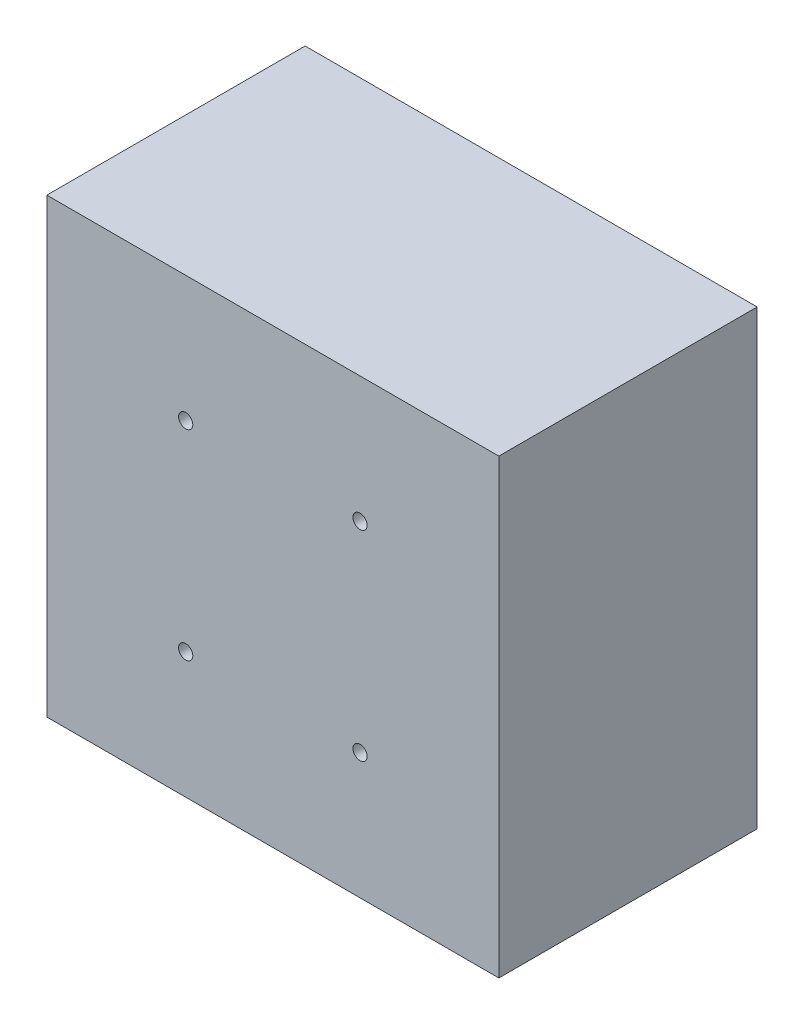
ISO-10303-21;
HEADER;
FILE_DESCRIPTION(('STEP AP214'),'2;1');
FILE_NAME('part.step','',(''),(''),'','','');
FILE_SCHEMA(('AUTOMOTIVE_DESIGN { 1 0 10303 214 1 1 1 1 }'));
ENDSEC;
DATA;
#1=APPLICATION_CONTEXT('core data for automotive mechanical design processes');
#2=APPLICATION_PROTOCOL_DEFINITION('international standard','automotive_design',2000,#1);
#3=PRODUCT_CONTEXT('',#1,'mechanical');
#4=PRODUCT('Part','Part','',(#3));
#5=PRODUCT_RELATED_PRODUCT_CATEGORY('part','',(#4));
#6=PRODUCT_DEFINITION_FORMATION('','',#4);
#7=PRODUCT_DEFINITION_CONTEXT('part definition',#1,'design');
#8=PRODUCT_DEFINITION('design','',#6,#7);
#9=PRODUCT_DEFINITION_SHAPE('','',#8);
#10=(LENGTH_UNIT() NAMED_UNIT(*) SI_UNIT(.MILLI.,.METRE.));
#11=(NAMED_UNIT(*) PLANE_ANGLE_UNIT() SI_UNIT($,.RADIAN.));
#12=(NAMED_UNIT(*) SI_UNIT($,.STERADIAN.) SOLID_ANGLE_UNIT());
#13=UNCERTAINTY_MEASURE_WITH_UNIT(LENGTH_MEASURE(1.E-05),#10,'distance_accuracy_value','');
#14=(GEOMETRIC_REPRESENTATION_CONTEXT(3) GLOBAL_UNCERTAINTY_ASSIGNED_CONTEXT((#13)) GLOBAL_UNIT_ASSIGNED_CONTEXT((#10,
#11,#12)) REPRESENTATION_CONTEXT('',''));
#15=CARTESIAN_POINT('',(0.,0.,0.));
#16=DIRECTION('',(0.,0.,1.));
#17=DIRECTION('',(1.,0.,0.));
#18=AXIS2_PLACEMENT_3D('',#15,#16,#17);
#19=CARTESIAN_POINT('',(0.,0.,40.));
#20=DIRECTION('',(1.,0.,0.));
#21=DIRECTION('',(0.,0.,-1.));
#22=AXIS2_PLACEMENT_3D('',#19,#20,#21);
#23=PLANE('',#22);
#24=DIRECTION('',(0.,-1.,0.));
#25=VECTOR('',#24,1.);
#26=CARTESIAN_POINT('',(0.,0.,0.));
#27=LINE('',#26,#25);
#28=CARTESIAN_POINT('',(0.,70.,0.));
#29=VERTEX_POINT('',#28);
#30=CARTESIAN_POINT('',(0.,0.,0.));
#31=VERTEX_POINT('',#30);
#32=EDGE_CURVE('E111',#29,#31,#27,.T.);
#33=ORIENTED_EDGE('',*,*,#32,.T.);
#34=DIRECTION('',(0.,0.,-1.));
#35=VECTOR('',#34,1.);
#36=CARTESIAN_POINT('',(0.,0.,40.));
#37=LINE('',#36,#35);
#38=CARTESIAN_POINT('',(0.,0.,40.));
#39=VERTEX_POINT('',#38);
#40=EDGE_CURVE('E11',#39,#31,#37,.T.);
#41=ORIENTED_EDGE('',*,*,#40,.F.);
#42=DIRECTION('',(0.,-1.,0.));
#43=VECTOR('',#42,1.);
#44=CARTESIAN_POINT('',(0.,0.,40.));
#45=LINE('',#44,#43);
#46=CARTESIAN_POINT('',(0.,70.,40.));
#47=VERTEX_POINT('',#46);
#48=EDGE_CURVE('E95',#47,#39,#45,.T.);
#49=ORIENTED_EDGE('',*,*,#48,.F.);
#50=DIRECTION('',(0.,0.,-1.));
#51=VECTOR('',#50,1.);
#52=CARTESIAN_POINT('',(0.,70.,40.));
#53=LINE('',#52,#51);
#54=EDGE_CURVE('E107',#47,#29,#53,.T.);
#55=ORIENTED_EDGE('',*,*,#54,.T.);
#56=EDGE_LOOP('',(#33,#41,#49,#55));
#57=FACE_BOUND('',#56,.T.);
#58=ADVANCED_FACE('F43',(#57),#23,.F.);
#59=CARTESIAN_POINT('',(0.,0.,40.));
#60=DIRECTION('',(0.,1.,0.));
#61=DIRECTION('',(0.,0.,1.));
#62=AXIS2_PLACEMENT_3D('',#59,#60,#61);
#63=PLANE('',#62);
#64=DIRECTION('',(1.,0.,0.));
#65=VECTOR('',#64,1.);
#66=CARTESIAN_POINT('',(0.,0.,0.));
#67=LINE('',#66,#65);
#68=CARTESIAN_POINT('',(70.,0.,0.));
#69=VERTEX_POINT('',#68);
#70=EDGE_CURVE('E100',#31,#69,#67,.T.);
#71=ORIENTED_EDGE('',*,*,#70,.T.);
#72=DIRECTION('',(0.,0.,-1.));
#73=VECTOR('',#72,1.);
#74=CARTESIAN_POINT('',(70.,0.,40.));
#75=LINE('',#74,#73);
#76=CARTESIAN_POINT('',(70.,0.,40.));
#77=VERTEX_POINT('',#76);
#78=EDGE_CURVE('E52',#77,#69,#75,.T.);
#79=ORIENTED_EDGE('',*,*,#78,.F.);
#80=DIRECTION('',(1.,0.,0.));
#81=VECTOR('',#80,1.);
#82=CARTESIAN_POINT('',(0.,0.,40.));
#83=LINE('',#82,#81);
#84=EDGE_CURVE('E90',#39,#77,#83,.T.);
#85=ORIENTED_EDGE('',*,*,#84,.F.);
#86=ORIENTED_EDGE('',*,*,#40,.T.);
#87=EDGE_LOOP('',(#71,#79,#85,#86));
#88=FACE_BOUND('',#87,.T.);
#89=ADVANCED_FACE('F99',(#88),#63,.F.);
#90=CARTESIAN_POINT('',(70.,0.,40.));
#91=DIRECTION('',(-1.,0.,0.));
#92=DIRECTION('',(0.,0.,1.));
#93=AXIS2_PLACEMENT_3D('',#90,#91,#92);
#94=PLANE('',#93);
#95=DIRECTION('',(0.,1.,0.));
#96=VECTOR('',#95,1.);
#97=CARTESIAN_POINT('',(70.,0.,0.));
#98=LINE('',#97,#96);
#99=CARTESIAN_POINT('',(70.,70.,0.));
#100=VERTEX_POINT('',#99);
#101=EDGE_CURVE('E77',#69,#100,#98,.T.);
#102=ORIENTED_EDGE('',*,*,#101,.T.);
#103=DIRECTION('',(0.,0.,-1.));
#104=VECTOR('',#103,1.);
#105=CARTESIAN_POINT('',(70.,70.,40.));
#106=LINE('',#105,#104);
#107=CARTESIAN_POINT('',(70.,70.,40.));
#108=VERTEX_POINT('',#107);
#109=EDGE_CURVE('E102',#108,#100,#106,.T.);
#110=ORIENTED_EDGE('',*,*,#109,.F.);
#111=DIRECTION('',(0.,1.,0.));
#112=VECTOR('',#111,1.);
#113=CARTESIAN_POINT('',(70.,0.,40.));
#114=LINE('',#113,#112);
#115=EDGE_CURVE('E93',#77,#108,#114,.T.);
#116=ORIENTED_EDGE('',*,*,#115,.F.);
#117=ORIENTED_EDGE('',*,*,#78,.T.);
#118=EDGE_LOOP('',(#102,#110,#116,#117));
#119=FACE_BOUND('',#118,.T.);
#120=ADVANCED_FACE('F103',(#119),#94,.F.);
#121=CARTESIAN_POINT('',(0.,70.,40.));
#122=DIRECTION('',(0.,-1.,0.));
#123=DIRECTION('',(0.,0.,-1.));
#124=AXIS2_PLACEMENT_3D('',#121,#122,#123);
#125=PLANE('',#124);
#126=DIRECTION('',(-1.,0.,0.));
#127=VECTOR('',#126,1.);
#128=CARTESIAN_POINT('',(0.,70.,0.));
#129=LINE('',#128,#127);
#130=EDGE_CURVE('E83',#100,#29,#129,.T.);
#131=ORIENTED_EDGE('',*,*,#130,.T.);
#132=ORIENTED_EDGE('',*,*,#54,.F.);
#133=DIRECTION('',(-1.,0.,0.));
#134=VECTOR('',#133,1.);
#135=CARTESIAN_POINT('',(0.,70.,40.));
#136=LINE('',#135,#134);
#137=EDGE_CURVE('E60',#108,#47,#136,.T.);
#138=ORIENTED_EDGE('',*,*,#137,.F.);
#139=ORIENTED_EDGE('',*,*,#109,.T.);
#140=EDGE_LOOP('',(#131,#132,#138,#139));
#141=FACE_BOUND('',#140,.T.);
#142=ADVANCED_FACE('F125',(#141),#125,.F.);
#143=CARTESIAN_POINT('',(0.,0.,40.));
#144=DIRECTION('',(0.,0.,-1.));
#145=DIRECTION('',(-1.,0.,0.));
#146=AXIS2_PLACEMENT_3D('',#143,#144,#145);
#147=PLANE('',#146);
#148=CARTESIAN_POINT('',(21.5,19.5,40.));
#149=DIRECTION('',(0.,0.,1.));
#150=DIRECTION('',(1.,0.,0.));
#151=AXIS2_PLACEMENT_3D('',#148,#149,#150);
#152=CIRCLE('',#151,1.1);
#153=CARTESIAN_POINT('',(22.6,19.5,40.));
#154=VERTEX_POINT('',#153);
#155=EDGE_CURVE('E140',#154,#154,#152,.T.);
#156=ORIENTED_EDGE('',*,*,#155,.F.);
#157=EDGE_LOOP('',(#156));
#158=FACE_BOUND('',#157,.T.);
#159=CARTESIAN_POINT('',(48.5,19.5,40.));
#160=DIRECTION('',(0.,0.,1.));
#161=DIRECTION('',(1.,0.,0.));
#162=AXIS2_PLACEMENT_3D('',#159,#160,#161);
#163=CIRCLE('',#162,1.1);
#164=CARTESIAN_POINT('',(49.6,19.5,40.));
#165=VERTEX_POINT('',#164);
#166=EDGE_CURVE('E148',#165,#165,#163,.T.);
#167=ORIENTED_EDGE('',*,*,#166,.F.);
#168=EDGE_LOOP('',(#167));
#169=FACE_BOUND('',#168,.T.);
#170=CARTESIAN_POINT('',(48.5,50.5,40.));
#171=DIRECTION('',(0.,0.,1.));
#172=DIRECTION('',(1.,0.,0.));
#173=AXIS2_PLACEMENT_3D('',#170,#171,#172);
#174=CIRCLE('',#173,1.1);
#175=CARTESIAN_POINT('',(49.6,50.5,40.));
#176=VERTEX_POINT('',#175);
#177=EDGE_CURVE('E156',#176,#176,#174,.T.);
#178=ORIENTED_EDGE('',*,*,#177,.F.);
#179=EDGE_LOOP('',(#178));
#180=FACE_BOUND('',#179,.T.);
#181=CARTESIAN_POINT('',(21.5,50.5,40.));
#182=DIRECTION('',(0.,0.,1.));
#183=DIRECTION('',(1.,0.,0.));
#184=AXIS2_PLACEMENT_3D('',#181,#182,#183);
#185=CIRCLE('',#184,1.09999999999999);
#186=CARTESIAN_POINT('',(22.6,50.5,40.));
#187=VERTEX_POINT('',#186);
#188=EDGE_CURVE('E132',#187,#187,#185,.T.);
#189=ORIENTED_EDGE('',*,*,#188,.F.);
#190=EDGE_LOOP('',(#189));
#191=FACE_BOUND('',#190,.T.);
#192=ORIENTED_EDGE('',*,*,#48,.T.);
#193=ORIENTED_EDGE('',*,*,#84,.T.);
#194=ORIENTED_EDGE('',*,*,#115,.T.);
#195=ORIENTED_EDGE('',*,*,#137,.T.);
#196=EDGE_LOOP('',(#192,#193,#194,#195));
#197=FACE_BOUND('',#196,.T.);
#198=ADVANCED_FACE('F91',(#158,#169,#180,#191,#197),#147,.F.);
#199=CARTESIAN_POINT('',(0.,0.,0.));
#200=DIRECTION('',(0.,0.,-1.));
#201=DIRECTION('',(-1.,0.,0.));
#202=AXIS2_PLACEMENT_3D('',#199,#200,#201);
#203=PLANE('',#202);
#204=ORIENTED_EDGE('',*,*,#32,.F.);
#205=ORIENTED_EDGE('',*,*,#130,.F.);
#206=ORIENTED_EDGE('',*,*,#101,.F.);
#207=ORIENTED_EDGE('',*,*,#70,.F.);
#208=EDGE_LOOP('',(#204,#205,#206,#207));
#209=FACE_BOUND('',#208,.T.);
#210=ADVANCED_FACE('F128',(#209),#203,.T.);
#211=CARTESIAN_POINT('',(21.5,50.5,20.));
#212=DIRECTION('',(0.,0.,1.));
#213=DIRECTION('',(1.,0.,0.));
#214=AXIS2_PLACEMENT_3D('',#211,#212,#213);
#215=CYLINDRICAL_SURFACE('',#214,1.09999999999999);
#216=CARTESIAN_POINT('',(21.5,50.5,20.));
#217=DIRECTION('',(0.,0.,1.));
#218=DIRECTION('',(1.,0.,0.));
#219=AXIS2_PLACEMENT_3D('',#216,#217,#218);
#220=CIRCLE('',#219,1.09999999999999);
#221=CARTESIAN_POINT('',(22.6,50.5,20.));
#222=VERTEX_POINT('',#221);
#223=EDGE_CURVE('E115',#222,#222,#220,.T.);
#224=ORIENTED_EDGE('',*,*,#223,.F.);
#225=EDGE_LOOP('',(#224));
#226=FACE_BOUND('',#225,.T.);
#227=ORIENTED_EDGE('',*,*,#188,.T.);
#228=EDGE_LOOP('',(#227));
#229=FACE_BOUND('',#228,.T.);
#230=ADVANCED_FACE('F179',(#226,#229),#215,.F.);
#231=CARTESIAN_POINT('',(0.,0.,20.));
#232=DIRECTION('',(0.,0.,1.));
#233=DIRECTION('',(1.,0.,0.));
#234=AXIS2_PLACEMENT_3D('',#231,#232,#233);
#235=PLANE('',#234);
#236=ORIENTED_EDGE('',*,*,#223,.T.);
#237=EDGE_LOOP('',(#236));
#238=FACE_BOUND('',#237,.T.);
#239=ADVANCED_FACE('F169',(#238),#235,.T.);
#240=CARTESIAN_POINT('',(48.5,50.5,20.));
#241=DIRECTION('',(0.,0.,1.));
#242=DIRECTION('',(1.,0.,0.));
#243=AXIS2_PLACEMENT_3D('',#240,#241,#242);
#244=CYLINDRICAL_SURFACE('',#243,1.1);
#245=CARTESIAN_POINT('',(48.5,50.5,20.));
#246=DIRECTION('',(0.,0.,1.));
#247=DIRECTION('',(1.,0.,0.));
#248=AXIS2_PLACEMENT_3D('',#245,#246,#247);
#249=CIRCLE('',#248,1.1);
#250=CARTESIAN_POINT('',(49.6,50.5,20.));
#251=VERTEX_POINT('',#250);
#252=EDGE_CURVE('E136',#251,#251,#249,.T.);
#253=ORIENTED_EDGE('',*,*,#252,.F.);
#254=EDGE_LOOP('',(#253));
#255=FACE_BOUND('',#254,.T.);
#256=ORIENTED_EDGE('',*,*,#177,.T.);
#257=EDGE_LOOP('',(#256));
#258=FACE_BOUND('',#257,.T.);
#259=ADVANCED_FACE('F166',(#255,#258),#244,.F.);
#260=CARTESIAN_POINT('',(0.,0.,20.));
#261=DIRECTION('',(0.,0.,1.));
#262=DIRECTION('',(1.,0.,0.));
#263=AXIS2_PLACEMENT_3D('',#260,#261,#262);
#264=PLANE('',#263);
#265=ORIENTED_EDGE('',*,*,#252,.T.);
#266=EDGE_LOOP('',(#265));
#267=FACE_BOUND('',#266,.T.);
#268=ADVANCED_FACE('F164',(#267),#264,.T.);
#269=CARTESIAN_POINT('',(48.5,19.5,20.));
#270=DIRECTION('',(0.,0.,1.));
#271=DIRECTION('',(1.,0.,0.));
#272=AXIS2_PLACEMENT_3D('',#269,#270,#271);
#273=CYLINDRICAL_SURFACE('',#272,1.1);
#274=CARTESIAN_POINT('',(48.5,19.5,20.));
#275=DIRECTION('',(0.,0.,1.));
#276=DIRECTION('',(1.,0.,0.));
#277=AXIS2_PLACEMENT_3D('',#274,#275,#276);
#278=CIRCLE('',#277,1.1);
#279=CARTESIAN_POINT('',(49.6,19.5,20.));
#280=VERTEX_POINT('',#279);
#281=EDGE_CURVE('E152',#280,#280,#278,.T.);
#282=ORIENTED_EDGE('',*,*,#281,.F.);
#283=EDGE_LOOP('',(#282));
#284=FACE_BOUND('',#283,.T.);
#285=ORIENTED_EDGE('',*,*,#166,.T.);
#286=EDGE_LOOP('',(#285));
#287=FACE_BOUND('',#286,.T.);
#288=ADVANCED_FACE('F249',(#284,#287),#273,.F.);
#289=CARTESIAN_POINT('',(0.,0.,20.));
#290=DIRECTION('',(0.,0.,1.));
#291=DIRECTION('',(1.,0.,0.));
#292=AXIS2_PLACEMENT_3D('',#289,#290,#291);
#293=PLANE('',#292);
#294=ORIENTED_EDGE('',*,*,#281,.T.);
#295=EDGE_LOOP('',(#294));
#296=FACE_BOUND('',#295,.T.);
#297=ADVANCED_FACE('F259',(#296),#293,.T.);
#298=CARTESIAN_POINT('',(21.5,19.5,20.));
#299=DIRECTION('',(0.,0.,1.));
#300=DIRECTION('',(1.,0.,0.));
#301=AXIS2_PLACEMENT_3D('',#298,#299,#300);
#302=CYLINDRICAL_SURFACE('',#301,1.1);
#303=CARTESIAN_POINT('',(21.5,19.5,20.));
#304=DIRECTION('',(0.,0.,1.));
#305=DIRECTION('',(1.,0.,0.));
#306=AXIS2_PLACEMENT_3D('',#303,#304,#305);
#307=CIRCLE('',#306,1.1);
#308=CARTESIAN_POINT('',(22.6,19.5,20.));
#309=VERTEX_POINT('',#308);
#310=EDGE_CURVE('E144',#309,#309,#307,.T.);
#311=ORIENTED_EDGE('',*,*,#310,.F.);
#312=EDGE_LOOP('',(#311));
#313=FACE_BOUND('',#312,.T.);
#314=ORIENTED_EDGE('',*,*,#155,.T.);
#315=EDGE_LOOP('',(#314));
#316=FACE_BOUND('',#315,.T.);
#317=ADVANCED_FACE('F270',(#313,#316),#302,.F.);
#318=CARTESIAN_POINT('',(0.,0.,20.));
#319=DIRECTION('',(0.,0.,1.));
#320=DIRECTION('',(1.,0.,0.));
#321=AXIS2_PLACEMENT_3D('',#318,#319,#320);
#322=PLANE('',#321);
#323=ORIENTED_EDGE('',*,*,#310,.T.);
#324=EDGE_LOOP('',(#323));
#325=FACE_BOUND('',#324,.T.);
#326=ADVANCED_FACE('F281',(#325),#322,.T.);
#327=CLOSED_SHELL('',(#58,#89,#120,#142,#198,#210,#230,#239,#259,#268,#288,#297,#317,#326));
#328=MANIFOLD_SOLID_BREP('B2',#327);
#329=ADVANCED_BREP_SHAPE_REPRESENTATION('',(#18,#328),#14);
#330=SHAPE_DEFINITION_REPRESENTATION(#9,#329);
ENDSEC;
END-ISO-10303-21;
